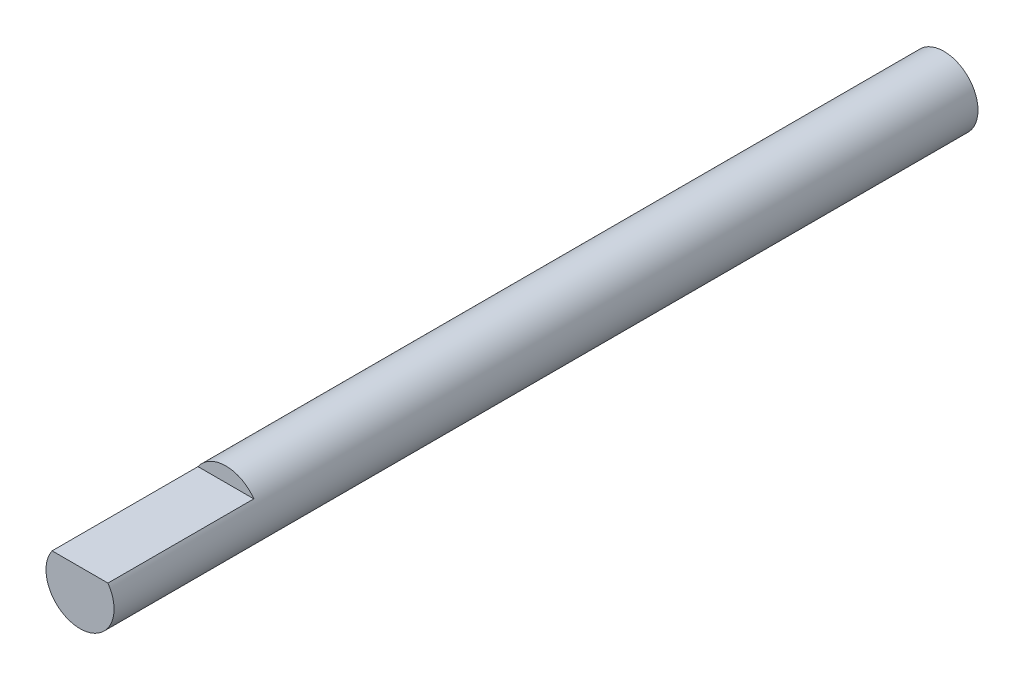
ISO-10303-21;
HEADER;
FILE_DESCRIPTION(('STEP AP214'),'2;1');
FILE_NAME('part.step','',(''),(''),'','','');
FILE_SCHEMA(('AUTOMOTIVE_DESIGN { 1 0 10303 214 1 1 1 1 }'));
ENDSEC;
DATA;
#1=APPLICATION_CONTEXT('core data for automotive mechanical design processes');
#2=APPLICATION_PROTOCOL_DEFINITION('international standard','automotive_design',2000,#1);
#3=PRODUCT_CONTEXT('',#1,'mechanical');
#4=PRODUCT('Part','Part','',(#3));
#5=PRODUCT_RELATED_PRODUCT_CATEGORY('part','',(#4));
#6=PRODUCT_DEFINITION_FORMATION('','',#4);
#7=PRODUCT_DEFINITION_CONTEXT('part definition',#1,'design');
#8=PRODUCT_DEFINITION('design','',#6,#7);
#9=PRODUCT_DEFINITION_SHAPE('','',#8);
#10=(LENGTH_UNIT() NAMED_UNIT(*) SI_UNIT(.MILLI.,.METRE.));
#11=(NAMED_UNIT(*) PLANE_ANGLE_UNIT() SI_UNIT($,.RADIAN.));
#12=(NAMED_UNIT(*) SI_UNIT($,.STERADIAN.) SOLID_ANGLE_UNIT());
#13=UNCERTAINTY_MEASURE_WITH_UNIT(LENGTH_MEASURE(1.E-05),#10,'distance_accuracy_value','');
#14=(GEOMETRIC_REPRESENTATION_CONTEXT(3) GLOBAL_UNCERTAINTY_ASSIGNED_CONTEXT((#13)) GLOBAL_UNIT_ASSIGNED_CONTEXT((#10,
#11,#12)) REPRESENTATION_CONTEXT('',''));
#15=CARTESIAN_POINT('',(0.,0.,0.));
#16=DIRECTION('',(0.,0.,1.));
#17=DIRECTION('',(1.,0.,0.));
#18=AXIS2_PLACEMENT_3D('',#15,#16,#17);
#19=CARTESIAN_POINT('',(0.,0.,177.7));
#20=DIRECTION('',(0.,0.,-1.));
#21=DIRECTION('',(-1.,0.,0.));
#22=AXIS2_PLACEMENT_3D('',#19,#20,#21);
#23=CYLINDRICAL_SURFACE('',#22,7.);
#24=CARTESIAN_POINT('',(0.,0.,177.7));
#25=DIRECTION('',(0.,0.,1.));
#26=DIRECTION('',(1.,0.,0.));
#27=AXIS2_PLACEMENT_3D('',#24,#25,#26);
#28=CIRCLE('',#27,7.);
#29=CARTESIAN_POINT('',(-5.74456264653803,4.,177.7));
#30=VERTEX_POINT('',#29);
#31=CARTESIAN_POINT('',(5.74456264653803,4.,177.7));
#32=VERTEX_POINT('',#31);
#33=EDGE_CURVE('E69',#30,#32,#28,.T.);
#34=ORIENTED_EDGE('',*,*,#33,.F.);
#35=DIRECTION('',(0.,0.,-1.));
#36=VECTOR('',#35,1.);
#37=CARTESIAN_POINT('',(-5.74456264653803,4.,177.7));
#38=LINE('',#37,#36);
#39=CARTESIAN_POINT('',(-5.74456264653803,4.,147.7));
#40=VERTEX_POINT('',#39);
#41=EDGE_CURVE('E54',#30,#40,#38,.T.);
#42=ORIENTED_EDGE('',*,*,#41,.T.);
#43=CARTESIAN_POINT('',(0.,0.,147.7));
#44=DIRECTION('',(0.,0.,1.));
#45=DIRECTION('',(1.,0.,0.));
#46=AXIS2_PLACEMENT_3D('',#43,#44,#45);
#47=CIRCLE('',#46,7.);
#48=CARTESIAN_POINT('',(5.74456264653803,4.,147.7));
#49=VERTEX_POINT('',#48);
#50=EDGE_CURVE('E11',#49,#40,#47,.T.);
#51=ORIENTED_EDGE('',*,*,#50,.F.);
#52=DIRECTION('',(0.,0.,-1.));
#53=VECTOR('',#52,1.);
#54=CARTESIAN_POINT('',(5.74456264653803,4.,177.7));
#55=LINE('',#54,#53);
#56=EDGE_CURVE('E59',#49,#32,#55,.F.);
#57=ORIENTED_EDGE('',*,*,#56,.T.);
#58=EDGE_LOOP('',(#34,#42,#51,#57));
#59=FACE_BOUND('',#58,.T.);
#60=CARTESIAN_POINT('',(0.,0.,0.));
#61=DIRECTION('',(0.,0.,1.));
#62=DIRECTION('',(1.,0.,0.));
#63=AXIS2_PLACEMENT_3D('',#60,#61,#62);
#64=CIRCLE('',#63,7.);
#65=CARTESIAN_POINT('',(7.,0.,0.));
#66=VERTEX_POINT('',#65);
#67=EDGE_CURVE('E78',#66,#66,#64,.T.);
#68=ORIENTED_EDGE('',*,*,#67,.T.);
#69=EDGE_LOOP('',(#68));
#70=FACE_BOUND('',#69,.T.);
#71=ADVANCED_FACE('F39',(#59,#70),#23,.T.);
#72=CARTESIAN_POINT('',(0.,0.,177.7));
#73=DIRECTION('',(0.,0.,1.));
#74=DIRECTION('',(1.,0.,0.));
#75=AXIS2_PLACEMENT_3D('',#72,#73,#74);
#76=PLANE('',#75);
#77=DIRECTION('',(1.,0.,0.));
#78=VECTOR('',#77,1.);
#79=CARTESIAN_POINT('',(0.,4.,177.7));
#80=LINE('',#79,#78);
#81=EDGE_CURVE('E47',#30,#32,#80,.T.);
#82=ORIENTED_EDGE('',*,*,#81,.F.);
#83=ORIENTED_EDGE('',*,*,#33,.T.);
#84=EDGE_LOOP('',(#82,#83));
#85=FACE_BOUND('',#84,.T.);
#86=ADVANCED_FACE('F76',(#85),#76,.T.);
#87=CARTESIAN_POINT('',(0.,0.,0.));
#88=DIRECTION('',(0.,0.,1.));
#89=DIRECTION('',(1.,0.,0.));
#90=AXIS2_PLACEMENT_3D('',#87,#88,#89);
#91=PLANE('',#90);
#92=ORIENTED_EDGE('',*,*,#67,.F.);
#93=EDGE_LOOP('',(#92));
#94=FACE_BOUND('',#93,.T.);
#95=ADVANCED_FACE('F90',(#94),#91,.F.);
#96=CARTESIAN_POINT('',(0.,0.,147.7));
#97=DIRECTION('',(0.,0.,1.));
#98=DIRECTION('',(1.,0.,0.));
#99=AXIS2_PLACEMENT_3D('',#96,#97,#98);
#100=PLANE('',#99);
#101=ORIENTED_EDGE('',*,*,#50,.T.);
#102=DIRECTION('',(1.,0.,0.));
#103=VECTOR('',#102,1.);
#104=CARTESIAN_POINT('',(-7.,4.,147.7));
#105=LINE('',#104,#103);
#106=EDGE_CURVE('E74',#40,#49,#105,.T.);
#107=ORIENTED_EDGE('',*,*,#106,.T.);
#108=EDGE_LOOP('',(#101,#107));
#109=FACE_BOUND('',#108,.T.);
#110=ADVANCED_FACE('F88',(#109),#100,.T.);
#111=CARTESIAN_POINT('',(-7.,4.,147.7));
#112=DIRECTION('',(0.,-1.,0.));
#113=DIRECTION('',(0.,0.,-1.));
#114=AXIS2_PLACEMENT_3D('',#111,#112,#113);
#115=PLANE('',#114);
#116=ORIENTED_EDGE('',*,*,#81,.T.);
#117=ORIENTED_EDGE('',*,*,#56,.F.);
#118=ORIENTED_EDGE('',*,*,#106,.F.);
#119=ORIENTED_EDGE('',*,*,#41,.F.);
#120=EDGE_LOOP('',(#116,#117,#118,#119));
#121=FACE_BOUND('',#120,.T.);
#122=ADVANCED_FACE('F64',(#121),#115,.F.);
#123=CLOSED_SHELL('',(#71,#86,#95,#110,#122));
#124=MANIFOLD_SOLID_BREP('B2',#123);
#125=ADVANCED_BREP_SHAPE_REPRESENTATION('',(#18,#124),#14);
#126=SHAPE_DEFINITION_REPRESENTATION(#9,#125);
ENDSEC;
END-ISO-10303-21;
